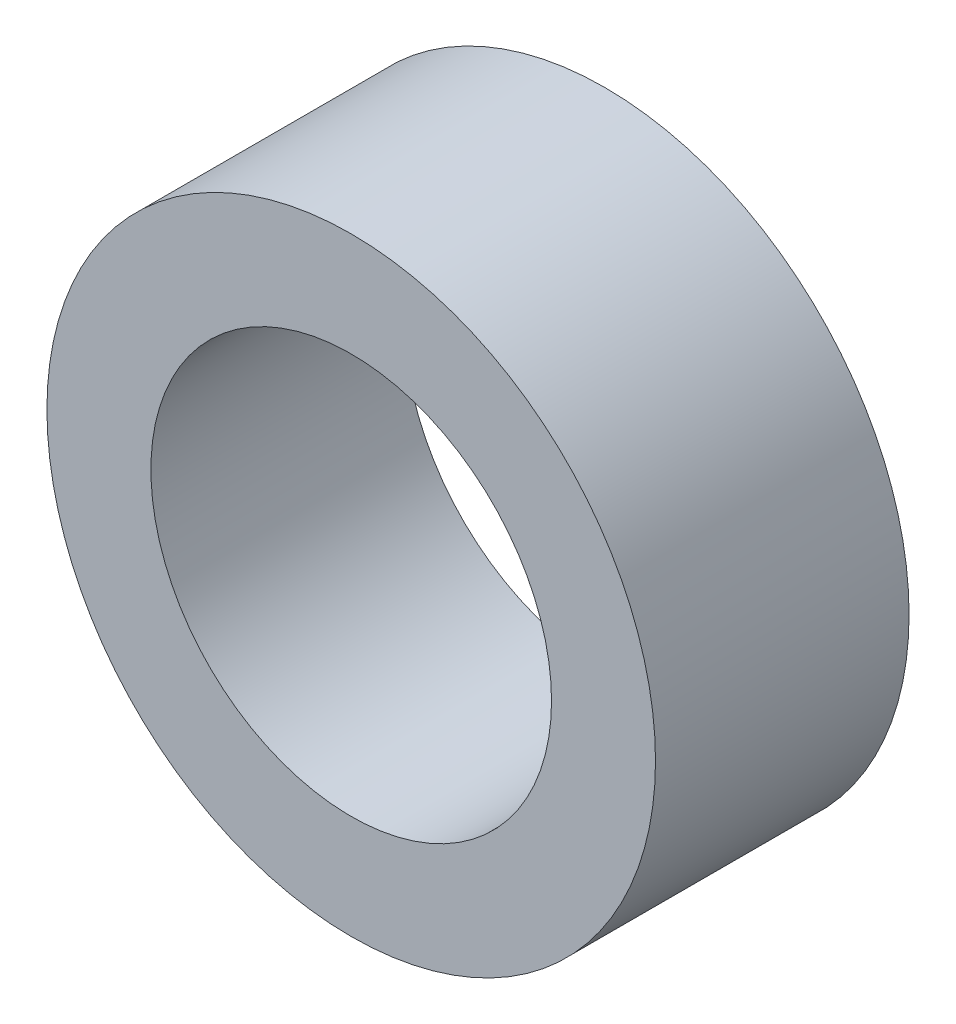
ISO-10303-21;
HEADER;
FILE_DESCRIPTION(('STEP AP214'),'2;1');
FILE_NAME('part.step','',(''),(''),'','','');
FILE_SCHEMA(('AUTOMOTIVE_DESIGN { 1 0 10303 214 1 1 1 1 }'));
ENDSEC;
DATA;
#1=APPLICATION_CONTEXT('core data for automotive mechanical design processes');
#2=APPLICATION_PROTOCOL_DEFINITION('international standard','automotive_design',2000,#1);
#3=PRODUCT_CONTEXT('',#1,'mechanical');
#4=PRODUCT('Part','Part','',(#3));
#5=PRODUCT_RELATED_PRODUCT_CATEGORY('part','',(#4));
#6=PRODUCT_DEFINITION_FORMATION('','',#4);
#7=PRODUCT_DEFINITION_CONTEXT('part definition',#1,'design');
#8=PRODUCT_DEFINITION('design','',#6,#7);
#9=PRODUCT_DEFINITION_SHAPE('','',#8);
#10=(LENGTH_UNIT() NAMED_UNIT(*) SI_UNIT(.MILLI.,.METRE.));
#11=(NAMED_UNIT(*) PLANE_ANGLE_UNIT() SI_UNIT($,.RADIAN.));
#12=(NAMED_UNIT(*) SI_UNIT($,.STERADIAN.) SOLID_ANGLE_UNIT());
#13=UNCERTAINTY_MEASURE_WITH_UNIT(LENGTH_MEASURE(1.E-05),#10,'distance_accuracy_value','');
#14=(GEOMETRIC_REPRESENTATION_CONTEXT(3) GLOBAL_UNCERTAINTY_ASSIGNED_CONTEXT((#13)) GLOBAL_UNIT_ASSIGNED_CONTEXT((#10,
#11,#12)) REPRESENTATION_CONTEXT('',''));
#15=CARTESIAN_POINT('',(0.,0.,0.));
#16=DIRECTION('',(0.,0.,1.));
#17=DIRECTION('',(1.,0.,0.));
#18=AXIS2_PLACEMENT_3D('',#15,#16,#17);
#19=CARTESIAN_POINT('',(0.,0.,5.));
#20=DIRECTION('',(0.,0.,1.));
#21=DIRECTION('',(1.,0.,0.));
#22=AXIS2_PLACEMENT_3D('',#19,#20,#21);
#23=PLANE('',#22);
#24=CARTESIAN_POINT('',(0.,0.,5.));
#25=DIRECTION('',(0.,0.,1.));
#26=DIRECTION('',(1.,0.,0.));
#27=AXIS2_PLACEMENT_3D('',#24,#25,#26);
#28=CIRCLE('',#27,6.);
#29=CARTESIAN_POINT('',(6.,0.,5.));
#30=VERTEX_POINT('',#29);
#31=EDGE_CURVE('E10',#30,#30,#28,.T.);
#32=ORIENTED_EDGE('',*,*,#31,.T.);
#33=EDGE_LOOP('',(#32));
#34=FACE_BOUND('',#33,.T.);
#35=CARTESIAN_POINT('',(0.,0.,5.));
#36=DIRECTION('',(0.,0.,1.));
#37=DIRECTION('',(1.,0.,0.));
#38=AXIS2_PLACEMENT_3D('',#35,#36,#37);
#39=CIRCLE('',#38,3.95);
#40=CARTESIAN_POINT('',(3.95,0.,5.));
#41=VERTEX_POINT('',#40);
#42=EDGE_CURVE('E42',#41,#41,#39,.T.);
#43=ORIENTED_EDGE('',*,*,#42,.F.);
#44=EDGE_LOOP('',(#43));
#45=FACE_BOUND('',#44,.T.);
#46=ADVANCED_FACE('F31',(#34,#45),#23,.T.);
#47=CARTESIAN_POINT('',(0.,0.,0.));
#48=DIRECTION('',(0.,0.,1.));
#49=DIRECTION('',(1.,0.,0.));
#50=AXIS2_PLACEMENT_3D('',#47,#48,#49);
#51=PLANE('',#50);
#52=CARTESIAN_POINT('',(0.,0.,0.));
#53=DIRECTION('',(0.,0.,1.));
#54=DIRECTION('',(1.,0.,0.));
#55=AXIS2_PLACEMENT_3D('',#52,#53,#54);
#56=CIRCLE('',#55,6.);
#57=CARTESIAN_POINT('',(6.,0.,0.));
#58=VERTEX_POINT('',#57);
#59=EDGE_CURVE('E35',#58,#58,#56,.T.);
#60=ORIENTED_EDGE('',*,*,#59,.F.);
#61=EDGE_LOOP('',(#60));
#62=FACE_BOUND('',#61,.T.);
#63=CARTESIAN_POINT('',(0.,0.,0.));
#64=DIRECTION('',(0.,0.,1.));
#65=DIRECTION('',(1.,0.,0.));
#66=AXIS2_PLACEMENT_3D('',#63,#64,#65);
#67=CIRCLE('',#66,3.95);
#68=CARTESIAN_POINT('',(3.95,0.,0.));
#69=VERTEX_POINT('',#68);
#70=EDGE_CURVE('E44',#69,#69,#67,.T.);
#71=ORIENTED_EDGE('',*,*,#70,.T.);
#72=EDGE_LOOP('',(#71));
#73=FACE_BOUND('',#72,.T.);
#74=ADVANCED_FACE('F54',(#62,#73),#51,.F.);
#75=CARTESIAN_POINT('',(0.,0.,5.));
#76=DIRECTION('',(0.,0.,-1.));
#77=DIRECTION('',(-1.,0.,0.));
#78=AXIS2_PLACEMENT_3D('',#75,#76,#77);
#79=CYLINDRICAL_SURFACE('',#78,6.);
#80=ORIENTED_EDGE('',*,*,#31,.F.);
#81=EDGE_LOOP('',(#80));
#82=FACE_BOUND('',#81,.T.);
#83=ORIENTED_EDGE('',*,*,#59,.T.);
#84=EDGE_LOOP('',(#83));
#85=FACE_BOUND('',#84,.T.);
#86=ADVANCED_FACE('F33',(#82,#85),#79,.T.);
#87=CARTESIAN_POINT('',(0.,0.,5.));
#88=DIRECTION('',(0.,0.,-1.));
#89=DIRECTION('',(-1.,0.,0.));
#90=AXIS2_PLACEMENT_3D('',#87,#88,#89);
#91=CYLINDRICAL_SURFACE('',#90,3.95);
#92=ORIENTED_EDGE('',*,*,#42,.T.);
#93=EDGE_LOOP('',(#92));
#94=FACE_BOUND('',#93,.T.);
#95=ORIENTED_EDGE('',*,*,#70,.F.);
#96=EDGE_LOOP('',(#95));
#97=FACE_BOUND('',#96,.T.);
#98=ADVANCED_FACE('F50',(#94,#97),#91,.F.);
#99=CLOSED_SHELL('',(#46,#74,#86,#98));
#100=MANIFOLD_SOLID_BREP('B2',#99);
#101=ADVANCED_BREP_SHAPE_REPRESENTATION('',(#18,#100),#14);
#102=SHAPE_DEFINITION_REPRESENTATION(#9,#101);
ENDSEC;
END-ISO-10303-21;
